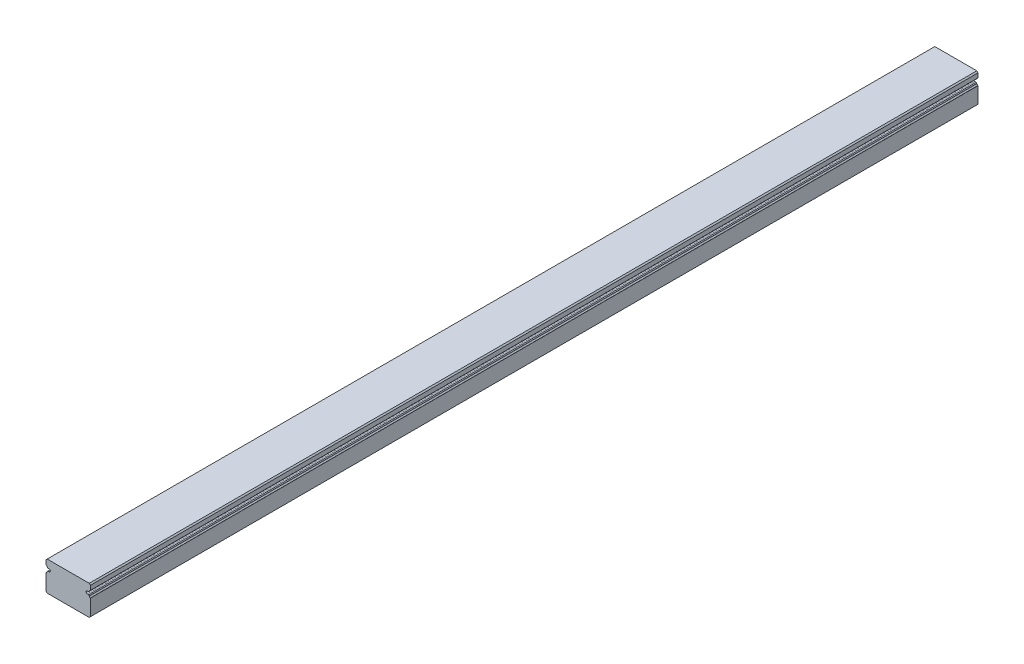
ISO-10303-21;
HEADER;
FILE_DESCRIPTION(('STEP AP214'),'2;1');
FILE_NAME('part.step','',(''),(''),'','','');
FILE_SCHEMA(('AUTOMOTIVE_DESIGN { 1 0 10303 214 1 1 1 1 }'));
ENDSEC;
DATA;
#1=APPLICATION_CONTEXT('core data for automotive mechanical design processes');
#2=APPLICATION_PROTOCOL_DEFINITION('international standard','automotive_design',2000,#1);
#3=PRODUCT_CONTEXT('',#1,'mechanical');
#4=PRODUCT('Part','Part','',(#3));
#5=PRODUCT_RELATED_PRODUCT_CATEGORY('part','',(#4));
#6=PRODUCT_DEFINITION_FORMATION('','',#4);
#7=PRODUCT_DEFINITION_CONTEXT('part definition',#1,'design');
#8=PRODUCT_DEFINITION('design','',#6,#7);
#9=PRODUCT_DEFINITION_SHAPE('','',#8);
#10=(LENGTH_UNIT() NAMED_UNIT(*) SI_UNIT(.MILLI.,.METRE.));
#11=(NAMED_UNIT(*) PLANE_ANGLE_UNIT() SI_UNIT($,.RADIAN.));
#12=(NAMED_UNIT(*) SI_UNIT($,.STERADIAN.) SOLID_ANGLE_UNIT());
#13=UNCERTAINTY_MEASURE_WITH_UNIT(LENGTH_MEASURE(1.E-05),#10,'distance_accuracy_value','');
#14=(GEOMETRIC_REPRESENTATION_CONTEXT(3) GLOBAL_UNCERTAINTY_ASSIGNED_CONTEXT((#13)) GLOBAL_UNIT_ASSIGNED_CONTEXT((#10,
#11,#12)) REPRESENTATION_CONTEXT('',''));
#15=CARTESIAN_POINT('',(0.,0.,0.));
#16=DIRECTION('',(0.,0.,1.));
#17=DIRECTION('',(1.,0.,0.));
#18=AXIS2_PLACEMENT_3D('',#15,#16,#17);
#19=CARTESIAN_POINT('',(7.51952374116363,1.28819952474976,150.));
#20=DIRECTION('',(0.,0.,-1.));
#21=DIRECTION('',(-1.,0.,0.));
#22=AXIS2_PLACEMENT_3D('',#19,#20,#21);
#23=CYLINDRICAL_SURFACE('',#22,0.400000000000003);
#24=CARTESIAN_POINT('',(7.51952374116363,1.28819952474976,-150.));
#25=DIRECTION('',(0.,0.,-1.));
#26=DIRECTION('',(1.,0.,0.));
#27=AXIS2_PLACEMENT_3D('',#24,#25,#26);
#28=CIRCLE('',#27,0.400000000000003);
#29=CARTESIAN_POINT('',(7.4639299734,0.8920816976,-150.));
#30=VERTEX_POINT('',#29);
#31=CARTESIAN_POINT('',(7.1195635475,1.2938425279,-150.));
#32=VERTEX_POINT('',#31);
#33=EDGE_CURVE('E250',#30,#32,#28,.T.);
#34=ORIENTED_EDGE('',*,*,#33,.T.);
#35=DIRECTION('',(0.,0.,-1.));
#36=VECTOR('',#35,1.);
#37=CARTESIAN_POINT('',(7.1195635475,1.2938425279,150.));
#38=LINE('',#37,#36);
#39=CARTESIAN_POINT('',(7.1195635475,1.2938425279,150.));
#40=VERTEX_POINT('',#39);
#41=EDGE_CURVE('E11',#40,#32,#38,.T.);
#42=ORIENTED_EDGE('',*,*,#41,.F.);
#43=CARTESIAN_POINT('',(7.51952374116363,1.28819952474976,150.));
#44=DIRECTION('',(0.,0.,-1.));
#45=DIRECTION('',(1.,0.,0.));
#46=AXIS2_PLACEMENT_3D('',#43,#44,#45);
#47=CIRCLE('',#46,0.400000000000003);
#48=CARTESIAN_POINT('',(7.4639299734,0.8920816976,150.));
#49=VERTEX_POINT('',#48);
#50=EDGE_CURVE('E304',#49,#40,#47,.T.);
#51=ORIENTED_EDGE('',*,*,#50,.F.);
#52=DIRECTION('',(0.,0.,-1.));
#53=VECTOR('',#52,1.);
#54=CARTESIAN_POINT('',(7.4639299734,0.8920816976,150.));
#55=LINE('',#54,#53);
#56=EDGE_CURVE('E246',#49,#30,#55,.T.);
#57=ORIENTED_EDGE('',*,*,#56,.T.);
#58=EDGE_LOOP('',(#34,#42,#51,#57));
#59=FACE_BOUND('',#58,.T.);
#60=ADVANCED_FACE('F34',(#59),#23,.F.);
#61=CARTESIAN_POINT('',(7.1195635475,1.2938425279,150.));
#62=DIRECTION('',(-0.759256602386219,-0.650791373431559,0.));
#63=DIRECTION('',(0.650791373431559,-0.759256602386219,0.));
#64=AXIS2_PLACEMENT_3D('',#61,#62,#63);
#65=PLANE('',#64);
#66=DIRECTION('',(-0.650791373431559,0.759256602386219,0.));
#67=VECTOR('',#66,1.);
#68=CARTESIAN_POINT('',(7.1195635475,1.2938425279,-150.));
#69=LINE('',#68,#67);
#70=CARTESIAN_POINT('',(6.9,1.55,-150.));
#71=VERTEX_POINT('',#70);
#72=EDGE_CURVE('E253',#32,#71,#69,.T.);
#73=ORIENTED_EDGE('',*,*,#72,.T.);
#74=DIRECTION('',(0.,0.,-1.));
#75=VECTOR('',#74,1.);
#76=CARTESIAN_POINT('',(6.9,1.55,150.));
#77=LINE('',#76,#75);
#78=CARTESIAN_POINT('',(6.9,1.55,150.));
#79=VERTEX_POINT('',#78);
#80=EDGE_CURVE('E42',#79,#71,#77,.T.);
#81=ORIENTED_EDGE('',*,*,#80,.F.);
#82=DIRECTION('',(-0.650791373431559,0.759256602386219,0.));
#83=VECTOR('',#82,1.);
#84=CARTESIAN_POINT('',(7.1195635475,1.2938425279,150.));
#85=LINE('',#84,#83);
#86=EDGE_CURVE('E153',#40,#79,#85,.T.);
#87=ORIENTED_EDGE('',*,*,#86,.F.);
#88=ORIENTED_EDGE('',*,*,#41,.T.);
#89=EDGE_LOOP('',(#73,#81,#87,#88));
#90=FACE_BOUND('',#89,.T.);
#91=ADVANCED_FACE('F462',(#90),#65,.F.);
#92=CARTESIAN_POINT('',(6.9,1.55,150.));
#93=DIRECTION('',(0.,-1.,0.));
#94=DIRECTION('',(0.,0.,-1.));
#95=AXIS2_PLACEMENT_3D('',#92,#93,#94);
#96=PLANE('',#95);
#97=DIRECTION('',(-1.,0.,0.));
#98=VECTOR('',#97,1.);
#99=CARTESIAN_POINT('',(6.9,1.55,-150.));
#100=LINE('',#99,#98);
#101=CARTESIAN_POINT('',(6.5,1.55,-150.));
#102=VERTEX_POINT('',#101);
#103=EDGE_CURVE('E255',#71,#102,#100,.T.);
#104=ORIENTED_EDGE('',*,*,#103,.T.);
#105=DIRECTION('',(0.,0.,-1.));
#106=VECTOR('',#105,1.);
#107=CARTESIAN_POINT('',(6.5,1.55,150.));
#108=LINE('',#107,#106);
#109=CARTESIAN_POINT('',(6.5,1.55,150.));
#110=VERTEX_POINT('',#109);
#111=EDGE_CURVE('E371',#110,#102,#108,.T.);
#112=ORIENTED_EDGE('',*,*,#111,.F.);
#113=DIRECTION('',(-1.,0.,0.));
#114=VECTOR('',#113,1.);
#115=CARTESIAN_POINT('',(6.9,1.55,150.));
#116=LINE('',#115,#114);
#117=EDGE_CURVE('E379',#79,#110,#116,.T.);
#118=ORIENTED_EDGE('',*,*,#117,.F.);
#119=ORIENTED_EDGE('',*,*,#80,.T.);
#120=EDGE_LOOP('',(#104,#112,#118,#119));
#121=FACE_BOUND('',#120,.T.);
#122=ADVANCED_FACE('F377',(#121),#96,.F.);
#123=CARTESIAN_POINT('',(6.5,2.,150.));
#124=DIRECTION('',(0.,0.,-1.));
#125=DIRECTION('',(-1.,0.,0.));
#126=AXIS2_PLACEMENT_3D('',#123,#124,#125);
#127=CYLINDRICAL_SURFACE('',#126,0.45);
#128=CARTESIAN_POINT('',(6.5,2.,-150.));
#129=DIRECTION('',(0.,0.,-1.));
#130=DIRECTION('',(1.,0.,0.));
#131=AXIS2_PLACEMENT_3D('',#128,#129,#130);
#132=CIRCLE('',#131,0.45);
#133=CARTESIAN_POINT('',(6.5,2.45,-150.));
#134=VERTEX_POINT('',#133);
#135=EDGE_CURVE('E257',#102,#134,#132,.T.);
#136=ORIENTED_EDGE('',*,*,#135,.T.);
#137=DIRECTION('',(0.,0.,-1.));
#138=VECTOR('',#137,1.);
#139=CARTESIAN_POINT('',(6.5,2.45,150.));
#140=LINE('',#139,#138);
#141=CARTESIAN_POINT('',(6.5,2.45,150.));
#142=VERTEX_POINT('',#141);
#143=EDGE_CURVE('E368',#142,#134,#140,.T.);
#144=ORIENTED_EDGE('',*,*,#143,.F.);
#145=CARTESIAN_POINT('',(6.5,2.,150.));
#146=DIRECTION('',(0.,0.,-1.));
#147=DIRECTION('',(1.,0.,0.));
#148=AXIS2_PLACEMENT_3D('',#145,#146,#147);
#149=CIRCLE('',#148,0.45);
#150=EDGE_CURVE('E397',#110,#142,#149,.T.);
#151=ORIENTED_EDGE('',*,*,#150,.F.);
#152=ORIENTED_EDGE('',*,*,#111,.T.);
#153=EDGE_LOOP('',(#136,#144,#151,#152));
#154=FACE_BOUND('',#153,.T.);
#155=ADVANCED_FACE('F388',(#154),#127,.F.);
#156=CARTESIAN_POINT('',(6.5,2.45,150.));
#157=DIRECTION('',(0.,1.,0.));
#158=DIRECTION('',(0.,0.,1.));
#159=AXIS2_PLACEMENT_3D('',#156,#157,#158);
#160=PLANE('',#159);
#161=DIRECTION('',(1.,0.,0.));
#162=VECTOR('',#161,1.);
#163=CARTESIAN_POINT('',(6.5,2.45,-150.));
#164=LINE('',#163,#162);
#165=CARTESIAN_POINT('',(6.9,2.45,-150.));
#166=VERTEX_POINT('',#165);
#167=EDGE_CURVE('E259',#134,#166,#164,.T.);
#168=ORIENTED_EDGE('',*,*,#167,.T.);
#169=DIRECTION('',(0.,0.,-1.));
#170=VECTOR('',#169,1.);
#171=CARTESIAN_POINT('',(6.9,2.45,150.));
#172=LINE('',#171,#170);
#173=CARTESIAN_POINT('',(6.9,2.45,150.));
#174=VERTEX_POINT('',#173);
#175=EDGE_CURVE('E365',#174,#166,#172,.T.);
#176=ORIENTED_EDGE('',*,*,#175,.F.);
#177=DIRECTION('',(1.,0.,0.));
#178=VECTOR('',#177,1.);
#179=CARTESIAN_POINT('',(6.5,2.45,150.));
#180=LINE('',#179,#178);
#181=EDGE_CURVE('E394',#142,#174,#180,.T.);
#182=ORIENTED_EDGE('',*,*,#181,.F.);
#183=ORIENTED_EDGE('',*,*,#143,.T.);
#184=EDGE_LOOP('',(#168,#176,#182,#183));
#185=FACE_BOUND('',#184,.T.);
#186=ADVANCED_FACE('F392',(#185),#160,.F.);
#187=CARTESIAN_POINT('',(6.9,2.45,150.));
#188=DIRECTION('',(-0.759256602386219,0.65079137343156,0.));
#189=DIRECTION('',(-0.65079137343156,-0.759256602386219,0.));
#190=AXIS2_PLACEMENT_3D('',#187,#188,#189);
#191=PLANE('',#190);
#192=DIRECTION('',(0.65079137343156,0.759256602386219,0.));
#193=VECTOR('',#192,1.);
#194=CARTESIAN_POINT('',(6.9,2.45,-150.));
#195=LINE('',#194,#193);
#196=CARTESIAN_POINT('',(7.1195635475,2.7061574721,-150.));
#197=VERTEX_POINT('',#196);
#198=EDGE_CURVE('E261',#166,#197,#195,.T.);
#199=ORIENTED_EDGE('',*,*,#198,.T.);
#200=DIRECTION('',(0.,0.,-1.));
#201=VECTOR('',#200,1.);
#202=CARTESIAN_POINT('',(7.1195635475,2.7061574721,150.));
#203=LINE('',#202,#201);
#204=CARTESIAN_POINT('',(7.1195635475,2.7061574721,150.));
#205=VERTEX_POINT('',#204);
#206=EDGE_CURVE('E362',#205,#197,#203,.T.);
#207=ORIENTED_EDGE('',*,*,#206,.F.);
#208=DIRECTION('',(0.65079137343156,0.759256602386219,0.));
#209=VECTOR('',#208,1.);
#210=CARTESIAN_POINT('',(6.9,2.45,150.));
#211=LINE('',#210,#209);
#212=EDGE_CURVE('E396',#174,#205,#211,.T.);
#213=ORIENTED_EDGE('',*,*,#212,.F.);
#214=ORIENTED_EDGE('',*,*,#175,.T.);
#215=EDGE_LOOP('',(#199,#207,#213,#214));
#216=FACE_BOUND('',#215,.T.);
#217=ADVANCED_FACE('F475',(#216),#191,.F.);
#218=CARTESIAN_POINT('',(7.51952374116363,2.71180047525024,150.));
#219=DIRECTION('',(0.,0.,-1.));
#220=DIRECTION('',(-1.,0.,0.));
#221=AXIS2_PLACEMENT_3D('',#218,#219,#220);
#222=CYLINDRICAL_SURFACE('',#221,0.400000000000004);
#223=CARTESIAN_POINT('',(7.51952374116363,2.71180047525024,-150.));
#224=DIRECTION('',(0.,0.,-1.));
#225=DIRECTION('',(1.,0.,0.));
#226=AXIS2_PLACEMENT_3D('',#223,#224,#225);
#227=CIRCLE('',#226,0.400000000000004);
#228=CARTESIAN_POINT('',(7.4639299734,3.1079183024,-150.));
#229=VERTEX_POINT('',#228);
#230=EDGE_CURVE('E263',#197,#229,#227,.T.);
#231=ORIENTED_EDGE('',*,*,#230,.T.);
#232=DIRECTION('',(0.,0.,-1.));
#233=VECTOR('',#232,1.);
#234=CARTESIAN_POINT('',(7.4639299734,3.1079183024,150.));
#235=LINE('',#234,#233);
#236=CARTESIAN_POINT('',(7.4639299734,3.1079183024,150.));
#237=VERTEX_POINT('',#236);
#238=EDGE_CURVE('E359',#237,#229,#235,.T.);
#239=ORIENTED_EDGE('',*,*,#238,.F.);
#240=CARTESIAN_POINT('',(7.51952374116363,2.71180047525024,150.));
#241=DIRECTION('',(0.,0.,-1.));
#242=DIRECTION('',(1.,0.,0.));
#243=AXIS2_PLACEMENT_3D('',#240,#241,#242);
#244=CIRCLE('',#243,0.400000000000004);
#245=EDGE_CURVE('E399',#205,#237,#244,.T.);
#246=ORIENTED_EDGE('',*,*,#245,.F.);
#247=ORIENTED_EDGE('',*,*,#206,.T.);
#248=EDGE_LOOP('',(#231,#239,#246,#247));
#249=FACE_BOUND('',#248,.T.);
#250=ADVANCED_FACE('F478',(#249),#222,.F.);
#251=CARTESIAN_POINT('',(7.4639299734,3.1079183024,150.));
#252=DIRECTION('',(-0.759256601601147,0.650791374347476,0.));
#253=DIRECTION('',(-0.650791374347476,-0.759256601601147,0.));
#254=AXIS2_PLACEMENT_3D('',#251,#252,#253);
#255=PLANE('',#254);
#256=DIRECTION('',(0.650791374347476,0.759256601601147,0.));
#257=VECTOR('',#256,1.);
#258=CARTESIAN_POINT('',(7.4639299734,3.1079183024,-150.));
#259=LINE('',#258,#257);
#260=CARTESIAN_POINT('',(7.5,3.15,-150.));
#261=VERTEX_POINT('',#260);
#262=EDGE_CURVE('E265',#229,#261,#259,.T.);
#263=ORIENTED_EDGE('',*,*,#262,.T.);
#264=DIRECTION('',(0.,0.,-1.));
#265=VECTOR('',#264,1.);
#266=CARTESIAN_POINT('',(7.5,3.15,150.));
#267=LINE('',#266,#265);
#268=CARTESIAN_POINT('',(7.5,3.15,150.));
#269=VERTEX_POINT('',#268);
#270=EDGE_CURVE('E356',#269,#261,#267,.T.);
#271=ORIENTED_EDGE('',*,*,#270,.F.);
#272=DIRECTION('',(0.650791374347476,0.759256601601147,0.));
#273=VECTOR('',#272,1.);
#274=CARTESIAN_POINT('',(7.4639299734,3.1079183024,150.));
#275=LINE('',#274,#273);
#276=EDGE_CURVE('E405',#237,#269,#275,.T.);
#277=ORIENTED_EDGE('',*,*,#276,.F.);
#278=ORIENTED_EDGE('',*,*,#238,.T.);
#279=EDGE_LOOP('',(#263,#271,#277,#278));
#280=FACE_BOUND('',#279,.T.);
#281=ADVANCED_FACE('F482',(#280),#255,.F.);
#282=CARTESIAN_POINT('',(7.5,3.15,150.));
#283=DIRECTION('',(-1.,0.,0.));
#284=DIRECTION('',(0.,0.,1.));
#285=AXIS2_PLACEMENT_3D('',#282,#283,#284);
#286=PLANE('',#285);
#287=DIRECTION('',(0.,1.,0.));
#288=VECTOR('',#287,1.);
#289=CARTESIAN_POINT('',(7.5,3.15,-150.));
#290=LINE('',#289,#288);
#291=CARTESIAN_POINT('',(7.5,4.6,-150.));
#292=VERTEX_POINT('',#291);
#293=EDGE_CURVE('E267',#261,#292,#290,.T.);
#294=ORIENTED_EDGE('',*,*,#293,.T.);
#295=DIRECTION('',(0.,0.,-1.));
#296=VECTOR('',#295,1.);
#297=CARTESIAN_POINT('',(7.5,4.6,150.));
#298=LINE('',#297,#296);
#299=CARTESIAN_POINT('',(7.5,4.6,150.));
#300=VERTEX_POINT('',#299);
#301=EDGE_CURVE('E353',#300,#292,#298,.T.);
#302=ORIENTED_EDGE('',*,*,#301,.F.);
#303=DIRECTION('',(0.,1.,0.));
#304=VECTOR('',#303,1.);
#305=CARTESIAN_POINT('',(7.5,3.15,150.));
#306=LINE('',#305,#304);
#307=EDGE_CURVE('E407',#269,#300,#306,.T.);
#308=ORIENTED_EDGE('',*,*,#307,.F.);
#309=ORIENTED_EDGE('',*,*,#270,.T.);
#310=EDGE_LOOP('',(#294,#302,#308,#309));
#311=FACE_BOUND('',#310,.T.);
#312=ADVANCED_FACE('F486',(#311),#286,.F.);
#313=CARTESIAN_POINT('',(7.5,4.6,150.));
#314=DIRECTION('',(-0.707106781186548,-0.707106781186548,0.));
#315=DIRECTION('',(0.707106781186548,-0.707106781186548,0.));
#316=AXIS2_PLACEMENT_3D('',#313,#314,#315);
#317=PLANE('',#316);
#318=DIRECTION('',(-0.707106781186548,0.707106781186548,0.));
#319=VECTOR('',#318,1.);
#320=CARTESIAN_POINT('',(7.5,4.6,-150.));
#321=LINE('',#320,#319);
#322=CARTESIAN_POINT('',(7.1,5.,-150.));
#323=VERTEX_POINT('',#322);
#324=EDGE_CURVE('E269',#292,#323,#321,.T.);
#325=ORIENTED_EDGE('',*,*,#324,.T.);
#326=DIRECTION('',(0.,0.,-1.));
#327=VECTOR('',#326,1.);
#328=CARTESIAN_POINT('',(7.1,5.,150.));
#329=LINE('',#328,#327);
#330=CARTESIAN_POINT('',(7.1,5.,150.));
#331=VERTEX_POINT('',#330);
#332=EDGE_CURVE('E350',#331,#323,#329,.T.);
#333=ORIENTED_EDGE('',*,*,#332,.F.);
#334=DIRECTION('',(-0.707106781186548,0.707106781186548,0.));
#335=VECTOR('',#334,1.);
#336=CARTESIAN_POINT('',(7.5,4.6,150.));
#337=LINE('',#336,#335);
#338=EDGE_CURVE('E409',#300,#331,#337,.T.);
#339=ORIENTED_EDGE('',*,*,#338,.F.);
#340=ORIENTED_EDGE('',*,*,#301,.T.);
#341=EDGE_LOOP('',(#325,#333,#339,#340));
#342=FACE_BOUND('',#341,.T.);
#343=ADVANCED_FACE('F490',(#342),#317,.F.);
#344=CARTESIAN_POINT('',(7.1,5.,150.));
#345=DIRECTION('',(0.,-1.,0.));
#346=DIRECTION('',(0.,0.,-1.));
#347=AXIS2_PLACEMENT_3D('',#344,#345,#346);
#348=PLANE('',#347);
#349=DIRECTION('',(-1.,0.,0.));
#350=VECTOR('',#349,1.);
#351=CARTESIAN_POINT('',(7.1,5.,-150.));
#352=LINE('',#351,#350);
#353=CARTESIAN_POINT('',(-7.1,5.,-150.));
#354=VERTEX_POINT('',#353);
#355=EDGE_CURVE('E271',#323,#354,#352,.T.);
#356=ORIENTED_EDGE('',*,*,#355,.T.);
#357=DIRECTION('',(0.,0.,-1.));
#358=VECTOR('',#357,1.);
#359=CARTESIAN_POINT('',(-7.1,5.,150.));
#360=LINE('',#359,#358);
#361=CARTESIAN_POINT('',(-7.1,5.,150.));
#362=VERTEX_POINT('',#361);
#363=EDGE_CURVE('E347',#362,#354,#360,.T.);
#364=ORIENTED_EDGE('',*,*,#363,.F.);
#365=DIRECTION('',(-1.,0.,0.));
#366=VECTOR('',#365,1.);
#367=CARTESIAN_POINT('',(7.1,5.,150.));
#368=LINE('',#367,#366);
#369=EDGE_CURVE('E411',#331,#362,#368,.T.);
#370=ORIENTED_EDGE('',*,*,#369,.F.);
#371=ORIENTED_EDGE('',*,*,#332,.T.);
#372=EDGE_LOOP('',(#356,#364,#370,#371));
#373=FACE_BOUND('',#372,.T.);
#374=ADVANCED_FACE('F494',(#373),#348,.F.);
#375=CARTESIAN_POINT('',(-7.1,5.,150.));
#376=DIRECTION('',(0.707106781186548,-0.707106781186548,0.));
#377=DIRECTION('',(0.707106781186548,0.707106781186548,0.));
#378=AXIS2_PLACEMENT_3D('',#375,#376,#377);
#379=PLANE('',#378);
#380=DIRECTION('',(-0.707106781186548,-0.707106781186548,0.));
#381=VECTOR('',#380,1.);
#382=CARTESIAN_POINT('',(-7.1,5.,-150.));
#383=LINE('',#382,#381);
#384=CARTESIAN_POINT('',(-7.5,4.6,-150.));
#385=VERTEX_POINT('',#384);
#386=EDGE_CURVE('E273',#354,#385,#383,.T.);
#387=ORIENTED_EDGE('',*,*,#386,.T.);
#388=DIRECTION('',(0.,0.,-1.));
#389=VECTOR('',#388,1.);
#390=CARTESIAN_POINT('',(-7.5,4.6,150.));
#391=LINE('',#390,#389);
#392=CARTESIAN_POINT('',(-7.5,4.6,150.));
#393=VERTEX_POINT('',#392);
#394=EDGE_CURVE('E344',#393,#385,#391,.T.);
#395=ORIENTED_EDGE('',*,*,#394,.F.);
#396=DIRECTION('',(-0.707106781186548,-0.707106781186548,0.));
#397=VECTOR('',#396,1.);
#398=CARTESIAN_POINT('',(-7.1,5.,150.));
#399=LINE('',#398,#397);
#400=EDGE_CURVE('E413',#362,#393,#399,.T.);
#401=ORIENTED_EDGE('',*,*,#400,.F.);
#402=ORIENTED_EDGE('',*,*,#363,.T.);
#403=EDGE_LOOP('',(#387,#395,#401,#402));
#404=FACE_BOUND('',#403,.T.);
#405=ADVANCED_FACE('F498',(#404),#379,.F.);
#406=CARTESIAN_POINT('',(-7.5,4.6,150.));
#407=DIRECTION('',(1.,0.,0.));
#408=DIRECTION('',(0.,0.,-1.));
#409=AXIS2_PLACEMENT_3D('',#406,#407,#408);
#410=PLANE('',#409);
#411=DIRECTION('',(0.,-1.,0.));
#412=VECTOR('',#411,1.);
#413=CARTESIAN_POINT('',(-7.5,4.6,-150.));
#414=LINE('',#413,#412);
#415=CARTESIAN_POINT('',(-7.5,3.15,-150.));
#416=VERTEX_POINT('',#415);
#417=EDGE_CURVE('E275',#385,#416,#414,.T.);
#418=ORIENTED_EDGE('',*,*,#417,.T.);
#419=DIRECTION('',(0.,0.,-1.));
#420=VECTOR('',#419,1.);
#421=CARTESIAN_POINT('',(-7.5,3.15,150.));
#422=LINE('',#421,#420);
#423=CARTESIAN_POINT('',(-7.5,3.15,150.));
#424=VERTEX_POINT('',#423);
#425=EDGE_CURVE('E341',#424,#416,#422,.T.);
#426=ORIENTED_EDGE('',*,*,#425,.F.);
#427=DIRECTION('',(0.,-1.,0.));
#428=VECTOR('',#427,1.);
#429=CARTESIAN_POINT('',(-7.5,4.6,150.));
#430=LINE('',#429,#428);
#431=EDGE_CURVE('E415',#393,#424,#430,.T.);
#432=ORIENTED_EDGE('',*,*,#431,.F.);
#433=ORIENTED_EDGE('',*,*,#394,.T.);
#434=EDGE_LOOP('',(#418,#426,#432,#433));
#435=FACE_BOUND('',#434,.T.);
#436=ADVANCED_FACE('F502',(#435),#410,.F.);
#437=CARTESIAN_POINT('',(-7.5,3.15,150.));
#438=DIRECTION('',(0.759256601601147,0.650791374347476,0.));
#439=DIRECTION('',(-0.650791374347476,0.759256601601147,0.));
#440=AXIS2_PLACEMENT_3D('',#437,#438,#439);
#441=PLANE('',#440);
#442=DIRECTION('',(0.650791374347476,-0.759256601601147,0.));
#443=VECTOR('',#442,1.);
#444=CARTESIAN_POINT('',(-7.5,3.15,-150.));
#445=LINE('',#444,#443);
#446=CARTESIAN_POINT('',(-7.4639299734,3.1079183024,-150.));
#447=VERTEX_POINT('',#446);
#448=EDGE_CURVE('E277',#416,#447,#445,.T.);
#449=ORIENTED_EDGE('',*,*,#448,.T.);
#450=DIRECTION('',(0.,0.,-1.));
#451=VECTOR('',#450,1.);
#452=CARTESIAN_POINT('',(-7.4639299734,3.1079183024,150.));
#453=LINE('',#452,#451);
#454=CARTESIAN_POINT('',(-7.4639299734,3.1079183024,150.));
#455=VERTEX_POINT('',#454);
#456=EDGE_CURVE('E338',#455,#447,#453,.T.);
#457=ORIENTED_EDGE('',*,*,#456,.F.);
#458=DIRECTION('',(0.650791374347476,-0.759256601601147,0.));
#459=VECTOR('',#458,1.);
#460=CARTESIAN_POINT('',(-7.5,3.15,150.));
#461=LINE('',#460,#459);
#462=EDGE_CURVE('E417',#424,#455,#461,.T.);
#463=ORIENTED_EDGE('',*,*,#462,.F.);
#464=ORIENTED_EDGE('',*,*,#425,.T.);
#465=EDGE_LOOP('',(#449,#457,#463,#464));
#466=FACE_BOUND('',#465,.T.);
#467=ADVANCED_FACE('F506',(#466),#441,.F.);
#468=CARTESIAN_POINT('',(-7.51952374116363,2.71180047525024,150.));
#469=DIRECTION('',(0.,0.,-1.));
#470=DIRECTION('',(-1.,0.,0.));
#471=AXIS2_PLACEMENT_3D('',#468,#469,#470);
#472=CYLINDRICAL_SURFACE('',#471,0.400000000000003);
#473=CARTESIAN_POINT('',(-7.51952374116363,2.71180047525024,-150.));
#474=DIRECTION('',(0.,0.,-1.));
#475=DIRECTION('',(1.,0.,0.));
#476=AXIS2_PLACEMENT_3D('',#473,#474,#475);
#477=CIRCLE('',#476,0.400000000000003);
#478=CARTESIAN_POINT('',(-7.1195635475,2.7061574721,-150.));
#479=VERTEX_POINT('',#478);
#480=EDGE_CURVE('E279',#447,#479,#477,.T.);
#481=ORIENTED_EDGE('',*,*,#480,.T.);
#482=DIRECTION('',(0.,0.,-1.));
#483=VECTOR('',#482,1.);
#484=CARTESIAN_POINT('',(-7.1195635475,2.7061574721,150.));
#485=LINE('',#484,#483);
#486=CARTESIAN_POINT('',(-7.1195635475,2.7061574721,150.));
#487=VERTEX_POINT('',#486);
#488=EDGE_CURVE('E335',#487,#479,#485,.T.);
#489=ORIENTED_EDGE('',*,*,#488,.F.);
#490=CARTESIAN_POINT('',(-7.51952374116363,2.71180047525024,150.));
#491=DIRECTION('',(0.,0.,-1.));
#492=DIRECTION('',(1.,0.,0.));
#493=AXIS2_PLACEMENT_3D('',#490,#491,#492);
#494=CIRCLE('',#493,0.400000000000003);
#495=EDGE_CURVE('E419',#455,#487,#494,.T.);
#496=ORIENTED_EDGE('',*,*,#495,.F.);
#497=ORIENTED_EDGE('',*,*,#456,.T.);
#498=EDGE_LOOP('',(#481,#489,#496,#497));
#499=FACE_BOUND('',#498,.T.);
#500=ADVANCED_FACE('F510',(#499),#472,.F.);
#501=CARTESIAN_POINT('',(-7.1195635475,2.7061574721,150.));
#502=DIRECTION('',(0.759256602386219,0.65079137343156,0.));
#503=DIRECTION('',(-0.65079137343156,0.759256602386219,0.));
#504=AXIS2_PLACEMENT_3D('',#501,#502,#503);
#505=PLANE('',#504);
#506=DIRECTION('',(0.65079137343156,-0.759256602386219,0.));
#507=VECTOR('',#506,1.);
#508=CARTESIAN_POINT('',(-7.1195635475,2.7061574721,-150.));
#509=LINE('',#508,#507);
#510=CARTESIAN_POINT('',(-6.9,2.45,-150.));
#511=VERTEX_POINT('',#510);
#512=EDGE_CURVE('E281',#479,#511,#509,.T.);
#513=ORIENTED_EDGE('',*,*,#512,.T.);
#514=DIRECTION('',(0.,0.,-1.));
#515=VECTOR('',#514,1.);
#516=CARTESIAN_POINT('',(-6.9,2.45,150.));
#517=LINE('',#516,#515);
#518=CARTESIAN_POINT('',(-6.9,2.45,150.));
#519=VERTEX_POINT('',#518);
#520=EDGE_CURVE('E332',#519,#511,#517,.T.);
#521=ORIENTED_EDGE('',*,*,#520,.F.);
#522=DIRECTION('',(0.65079137343156,-0.759256602386219,0.));
#523=VECTOR('',#522,1.);
#524=CARTESIAN_POINT('',(-7.1195635475,2.7061574721,150.));
#525=LINE('',#524,#523);
#526=EDGE_CURVE('E421',#487,#519,#525,.T.);
#527=ORIENTED_EDGE('',*,*,#526,.F.);
#528=ORIENTED_EDGE('',*,*,#488,.T.);
#529=EDGE_LOOP('',(#513,#521,#527,#528));
#530=FACE_BOUND('',#529,.T.);
#531=ADVANCED_FACE('F514',(#530),#505,.F.);
#532=CARTESIAN_POINT('',(-6.9,2.45,150.));
#533=DIRECTION('',(0.,1.,0.));
#534=DIRECTION('',(0.,0.,1.));
#535=AXIS2_PLACEMENT_3D('',#532,#533,#534);
#536=PLANE('',#535);
#537=DIRECTION('',(1.,0.,0.));
#538=VECTOR('',#537,1.);
#539=CARTESIAN_POINT('',(-6.9,2.45,-150.));
#540=LINE('',#539,#538);
#541=CARTESIAN_POINT('',(-6.5,2.45,-150.));
#542=VERTEX_POINT('',#541);
#543=EDGE_CURVE('E283',#511,#542,#540,.T.);
#544=ORIENTED_EDGE('',*,*,#543,.T.);
#545=DIRECTION('',(0.,0.,-1.));
#546=VECTOR('',#545,1.);
#547=CARTESIAN_POINT('',(-6.5,2.45,150.));
#548=LINE('',#547,#546);
#549=CARTESIAN_POINT('',(-6.5,2.45,150.));
#550=VERTEX_POINT('',#549);
#551=EDGE_CURVE('E329',#550,#542,#548,.T.);
#552=ORIENTED_EDGE('',*,*,#551,.F.);
#553=DIRECTION('',(1.,0.,0.));
#554=VECTOR('',#553,1.);
#555=CARTESIAN_POINT('',(-6.9,2.45,150.));
#556=LINE('',#555,#554);
#557=EDGE_CURVE('E423',#519,#550,#556,.T.);
#558=ORIENTED_EDGE('',*,*,#557,.F.);
#559=ORIENTED_EDGE('',*,*,#520,.T.);
#560=EDGE_LOOP('',(#544,#552,#558,#559));
#561=FACE_BOUND('',#560,.T.);
#562=ADVANCED_FACE('F518',(#561),#536,.F.);
#563=CARTESIAN_POINT('',(-6.5,2.,150.));
#564=DIRECTION('',(0.,0.,-1.));
#565=DIRECTION('',(-1.,0.,0.));
#566=AXIS2_PLACEMENT_3D('',#563,#564,#565);
#567=CYLINDRICAL_SURFACE('',#566,0.45);
#568=CARTESIAN_POINT('',(-6.5,2.,-150.));
#569=DIRECTION('',(0.,0.,-1.));
#570=DIRECTION('',(1.,0.,0.));
#571=AXIS2_PLACEMENT_3D('',#568,#569,#570);
#572=CIRCLE('',#571,0.45);
#573=CARTESIAN_POINT('',(-6.5,1.55,-150.));
#574=VERTEX_POINT('',#573);
#575=EDGE_CURVE('E285',#542,#574,#572,.T.);
#576=ORIENTED_EDGE('',*,*,#575,.T.);
#577=DIRECTION('',(0.,0.,-1.));
#578=VECTOR('',#577,1.);
#579=CARTESIAN_POINT('',(-6.5,1.55,150.));
#580=LINE('',#579,#578);
#581=CARTESIAN_POINT('',(-6.5,1.55,150.));
#582=VERTEX_POINT('',#581);
#583=EDGE_CURVE('E326',#582,#574,#580,.T.);
#584=ORIENTED_EDGE('',*,*,#583,.F.);
#585=CARTESIAN_POINT('',(-6.5,2.,150.));
#586=DIRECTION('',(0.,0.,-1.));
#587=DIRECTION('',(1.,0.,0.));
#588=AXIS2_PLACEMENT_3D('',#585,#586,#587);
#589=CIRCLE('',#588,0.45);
#590=EDGE_CURVE('E425',#550,#582,#589,.T.);
#591=ORIENTED_EDGE('',*,*,#590,.F.);
#592=ORIENTED_EDGE('',*,*,#551,.T.);
#593=EDGE_LOOP('',(#576,#584,#591,#592));
#594=FACE_BOUND('',#593,.T.);
#595=ADVANCED_FACE('F522',(#594),#567,.F.);
#596=CARTESIAN_POINT('',(-6.5,1.55,150.));
#597=DIRECTION('',(0.,-1.,0.));
#598=DIRECTION('',(0.,0.,-1.));
#599=AXIS2_PLACEMENT_3D('',#596,#597,#598);
#600=PLANE('',#599);
#601=DIRECTION('',(-1.,0.,0.));
#602=VECTOR('',#601,1.);
#603=CARTESIAN_POINT('',(-6.5,1.55,-150.));
#604=LINE('',#603,#602);
#605=CARTESIAN_POINT('',(-6.9,1.55,-150.));
#606=VERTEX_POINT('',#605);
#607=EDGE_CURVE('E287',#574,#606,#604,.T.);
#608=ORIENTED_EDGE('',*,*,#607,.T.);
#609=DIRECTION('',(0.,0.,-1.));
#610=VECTOR('',#609,1.);
#611=CARTESIAN_POINT('',(-6.9,1.55,150.));
#612=LINE('',#611,#610);
#613=CARTESIAN_POINT('',(-6.9,1.55,150.));
#614=VERTEX_POINT('',#613);
#615=EDGE_CURVE('E323',#614,#606,#612,.T.);
#616=ORIENTED_EDGE('',*,*,#615,.F.);
#617=DIRECTION('',(-1.,0.,0.));
#618=VECTOR('',#617,1.);
#619=CARTESIAN_POINT('',(-6.5,1.55,150.));
#620=LINE('',#619,#618);
#621=EDGE_CURVE('E427',#582,#614,#620,.T.);
#622=ORIENTED_EDGE('',*,*,#621,.F.);
#623=ORIENTED_EDGE('',*,*,#583,.T.);
#624=EDGE_LOOP('',(#608,#616,#622,#623));
#625=FACE_BOUND('',#624,.T.);
#626=ADVANCED_FACE('F526',(#625),#600,.F.);
#627=CARTESIAN_POINT('',(-6.9,1.55,150.));
#628=DIRECTION('',(0.759256602386219,-0.650791373431559,0.));
#629=DIRECTION('',(0.650791373431559,0.759256602386219,0.));
#630=AXIS2_PLACEMENT_3D('',#627,#628,#629);
#631=PLANE('',#630);
#632=DIRECTION('',(-0.650791373431559,-0.759256602386219,0.));
#633=VECTOR('',#632,1.);
#634=CARTESIAN_POINT('',(-6.9,1.55,-150.));
#635=LINE('',#634,#633);
#636=CARTESIAN_POINT('',(-7.1195635475,1.2938425279,-150.));
#637=VERTEX_POINT('',#636);
#638=EDGE_CURVE('E289',#606,#637,#635,.T.);
#639=ORIENTED_EDGE('',*,*,#638,.T.);
#640=DIRECTION('',(0.,0.,-1.));
#641=VECTOR('',#640,1.);
#642=CARTESIAN_POINT('',(-7.1195635475,1.2938425279,150.));
#643=LINE('',#642,#641);
#644=CARTESIAN_POINT('',(-7.1195635475,1.2938425279,150.));
#645=VERTEX_POINT('',#644);
#646=EDGE_CURVE('E320',#645,#637,#643,.T.);
#647=ORIENTED_EDGE('',*,*,#646,.F.);
#648=DIRECTION('',(-0.650791373431559,-0.759256602386219,0.));
#649=VECTOR('',#648,1.);
#650=CARTESIAN_POINT('',(-6.9,1.55,150.));
#651=LINE('',#650,#649);
#652=EDGE_CURVE('E429',#614,#645,#651,.T.);
#653=ORIENTED_EDGE('',*,*,#652,.F.);
#654=ORIENTED_EDGE('',*,*,#615,.T.);
#655=EDGE_LOOP('',(#639,#647,#653,#654));
#656=FACE_BOUND('',#655,.T.);
#657=ADVANCED_FACE('F530',(#656),#631,.F.);
#658=CARTESIAN_POINT('',(-7.51952374116363,1.28819952474976,150.));
#659=DIRECTION('',(0.,0.,-1.));
#660=DIRECTION('',(-1.,0.,0.));
#661=AXIS2_PLACEMENT_3D('',#658,#659,#660);
#662=CYLINDRICAL_SURFACE('',#661,0.400000000000003);
#663=CARTESIAN_POINT('',(-7.51952374116363,1.28819952474976,-150.));
#664=DIRECTION('',(0.,0.,-1.));
#665=DIRECTION('',(1.,0.,0.));
#666=AXIS2_PLACEMENT_3D('',#663,#664,#665);
#667=CIRCLE('',#666,0.400000000000003);
#668=CARTESIAN_POINT('',(-7.4639299734,0.8920816976,-150.));
#669=VERTEX_POINT('',#668);
#670=EDGE_CURVE('E291',#637,#669,#667,.T.);
#671=ORIENTED_EDGE('',*,*,#670,.T.);
#672=DIRECTION('',(0.,0.,-1.));
#673=VECTOR('',#672,1.);
#674=CARTESIAN_POINT('',(-7.4639299734,0.8920816976,150.));
#675=LINE('',#674,#673);
#676=CARTESIAN_POINT('',(-7.4639299734,0.8920816976,150.));
#677=VERTEX_POINT('',#676);
#678=EDGE_CURVE('E317',#677,#669,#675,.T.);
#679=ORIENTED_EDGE('',*,*,#678,.F.);
#680=CARTESIAN_POINT('',(-7.51952374116363,1.28819952474976,150.));
#681=DIRECTION('',(0.,0.,-1.));
#682=DIRECTION('',(1.,0.,0.));
#683=AXIS2_PLACEMENT_3D('',#680,#681,#682);
#684=CIRCLE('',#683,0.400000000000003);
#685=EDGE_CURVE('E431',#645,#677,#684,.T.);
#686=ORIENTED_EDGE('',*,*,#685,.F.);
#687=ORIENTED_EDGE('',*,*,#646,.T.);
#688=EDGE_LOOP('',(#671,#679,#686,#687));
#689=FACE_BOUND('',#688,.T.);
#690=ADVANCED_FACE('F534',(#689),#662,.F.);
#691=CARTESIAN_POINT('',(-7.4639299734,0.8920816976,150.));
#692=DIRECTION('',(0.759256601601146,-0.650791374347477,0.));
#693=DIRECTION('',(0.650791374347477,0.759256601601146,0.));
#694=AXIS2_PLACEMENT_3D('',#691,#692,#693);
#695=PLANE('',#694);
#696=DIRECTION('',(-0.650791374347477,-0.759256601601146,0.));
#697=VECTOR('',#696,1.);
#698=CARTESIAN_POINT('',(-7.4639299734,0.8920816976,-150.));
#699=LINE('',#698,#697);
#700=CARTESIAN_POINT('',(-7.5,0.85,-150.));
#701=VERTEX_POINT('',#700);
#702=EDGE_CURVE('E293',#669,#701,#699,.T.);
#703=ORIENTED_EDGE('',*,*,#702,.T.);
#704=DIRECTION('',(0.,0.,-1.));
#705=VECTOR('',#704,1.);
#706=CARTESIAN_POINT('',(-7.5,0.85,150.));
#707=LINE('',#706,#705);
#708=CARTESIAN_POINT('',(-7.5,0.85,150.));
#709=VERTEX_POINT('',#708);
#710=EDGE_CURVE('E314',#709,#701,#707,.T.);
#711=ORIENTED_EDGE('',*,*,#710,.F.);
#712=DIRECTION('',(-0.650791374347477,-0.759256601601146,0.));
#713=VECTOR('',#712,1.);
#714=CARTESIAN_POINT('',(-7.4639299734,0.8920816976,150.));
#715=LINE('',#714,#713);
#716=EDGE_CURVE('E433',#677,#709,#715,.T.);
#717=ORIENTED_EDGE('',*,*,#716,.F.);
#718=ORIENTED_EDGE('',*,*,#678,.T.);
#719=EDGE_LOOP('',(#703,#711,#717,#718));
#720=FACE_BOUND('',#719,.T.);
#721=ADVANCED_FACE('F538',(#720),#695,.F.);
#722=CARTESIAN_POINT('',(-7.5,0.85,150.));
#723=DIRECTION('',(1.,0.,0.));
#724=DIRECTION('',(0.,0.,-1.));
#725=AXIS2_PLACEMENT_3D('',#722,#723,#724);
#726=PLANE('',#725);
#727=DIRECTION('',(0.,-1.,0.));
#728=VECTOR('',#727,1.);
#729=CARTESIAN_POINT('',(-7.5,0.85,-150.));
#730=LINE('',#729,#728);
#731=CARTESIAN_POINT('',(-7.5,-4.6,-150.));
#732=VERTEX_POINT('',#731);
#733=EDGE_CURVE('E295',#701,#732,#730,.T.);
#734=ORIENTED_EDGE('',*,*,#733,.T.);
#735=DIRECTION('',(0.,0.,-1.));
#736=VECTOR('',#735,1.);
#737=CARTESIAN_POINT('',(-7.5,-4.6,150.));
#738=LINE('',#737,#736);
#739=CARTESIAN_POINT('',(-7.5,-4.6,150.));
#740=VERTEX_POINT('',#739);
#741=EDGE_CURVE('E311',#740,#732,#738,.T.);
#742=ORIENTED_EDGE('',*,*,#741,.F.);
#743=DIRECTION('',(0.,-1.,0.));
#744=VECTOR('',#743,1.);
#745=CARTESIAN_POINT('',(-7.5,0.85,150.));
#746=LINE('',#745,#744);
#747=EDGE_CURVE('E435',#709,#740,#746,.T.);
#748=ORIENTED_EDGE('',*,*,#747,.F.);
#749=ORIENTED_EDGE('',*,*,#710,.T.);
#750=EDGE_LOOP('',(#734,#742,#748,#749));
#751=FACE_BOUND('',#750,.T.);
#752=ADVANCED_FACE('F542',(#751),#726,.F.);
#753=CARTESIAN_POINT('',(-7.5,-4.6,150.));
#754=DIRECTION('',(0.707106781186548,0.707106781186548,0.));
#755=DIRECTION('',(-0.707106781186548,0.707106781186548,0.));
#756=AXIS2_PLACEMENT_3D('',#753,#754,#755);
#757=PLANE('',#756);
#758=DIRECTION('',(0.707106781186548,-0.707106781186548,0.));
#759=VECTOR('',#758,1.);
#760=CARTESIAN_POINT('',(-7.5,-4.6,-150.));
#761=LINE('',#760,#759);
#762=CARTESIAN_POINT('',(-7.1,-5.,-150.));
#763=VERTEX_POINT('',#762);
#764=EDGE_CURVE('E297',#732,#763,#761,.T.);
#765=ORIENTED_EDGE('',*,*,#764,.T.);
#766=DIRECTION('',(0.,0.,-1.));
#767=VECTOR('',#766,1.);
#768=CARTESIAN_POINT('',(-7.1,-5.,150.));
#769=LINE('',#768,#767);
#770=CARTESIAN_POINT('',(-7.1,-5.,150.));
#771=VERTEX_POINT('',#770);
#772=EDGE_CURVE('E308',#771,#763,#769,.T.);
#773=ORIENTED_EDGE('',*,*,#772,.F.);
#774=DIRECTION('',(0.707106781186548,-0.707106781186548,0.));
#775=VECTOR('',#774,1.);
#776=CARTESIAN_POINT('',(-7.5,-4.6,150.));
#777=LINE('',#776,#775);
#778=EDGE_CURVE('E437',#740,#771,#777,.T.);
#779=ORIENTED_EDGE('',*,*,#778,.F.);
#780=ORIENTED_EDGE('',*,*,#741,.T.);
#781=EDGE_LOOP('',(#765,#773,#779,#780));
#782=FACE_BOUND('',#781,.T.);
#783=ADVANCED_FACE('F443',(#782),#757,.F.);
#784=CARTESIAN_POINT('',(-7.1,-5.,150.));
#785=DIRECTION('',(0.,1.,0.));
#786=DIRECTION('',(0.,0.,1.));
#787=AXIS2_PLACEMENT_3D('',#784,#785,#786);
#788=PLANE('',#787);
#789=DIRECTION('',(1.,0.,0.));
#790=VECTOR('',#789,1.);
#791=CARTESIAN_POINT('',(-7.1,-5.,-150.));
#792=LINE('',#791,#790);
#793=CARTESIAN_POINT('',(7.1,-5.,-150.));
#794=VERTEX_POINT('',#793);
#795=EDGE_CURVE('E299',#763,#794,#792,.T.);
#796=ORIENTED_EDGE('',*,*,#795,.T.);
#797=DIRECTION('',(0.,0.,-1.));
#798=VECTOR('',#797,1.);
#799=CARTESIAN_POINT('',(7.1,-5.,150.));
#800=LINE('',#799,#798);
#801=CARTESIAN_POINT('',(7.1,-5.,150.));
#802=VERTEX_POINT('',#801);
#803=EDGE_CURVE('E241',#802,#794,#800,.T.);
#804=ORIENTED_EDGE('',*,*,#803,.F.);
#805=DIRECTION('',(1.,0.,0.));
#806=VECTOR('',#805,1.);
#807=CARTESIAN_POINT('',(-7.1,-5.,150.));
#808=LINE('',#807,#806);
#809=EDGE_CURVE('E232',#771,#802,#808,.T.);
#810=ORIENTED_EDGE('',*,*,#809,.F.);
#811=ORIENTED_EDGE('',*,*,#772,.T.);
#812=EDGE_LOOP('',(#796,#804,#810,#811));
#813=FACE_BOUND('',#812,.T.);
#814=ADVANCED_FACE('F447',(#813),#788,.F.);
#815=CARTESIAN_POINT('',(7.1,-5.,150.));
#816=DIRECTION('',(-0.707106781186548,0.707106781186548,0.));
#817=DIRECTION('',(-0.707106781186548,-0.707106781186548,0.));
#818=AXIS2_PLACEMENT_3D('',#815,#816,#817);
#819=PLANE('',#818);
#820=DIRECTION('',(0.707106781186548,0.707106781186548,0.));
#821=VECTOR('',#820,1.);
#822=CARTESIAN_POINT('',(7.1,-5.,-150.));
#823=LINE('',#822,#821);
#824=CARTESIAN_POINT('',(7.5,-4.6,-150.));
#825=VERTEX_POINT('',#824);
#826=EDGE_CURVE('E240',#794,#825,#823,.T.);
#827=ORIENTED_EDGE('',*,*,#826,.T.);
#828=DIRECTION('',(0.,0.,-1.));
#829=VECTOR('',#828,1.);
#830=CARTESIAN_POINT('',(7.5,-4.6,150.));
#831=LINE('',#830,#829);
#832=CARTESIAN_POINT('',(7.5,-4.6,150.));
#833=VERTEX_POINT('',#832);
#834=EDGE_CURVE('E237',#833,#825,#831,.T.);
#835=ORIENTED_EDGE('',*,*,#834,.F.);
#836=DIRECTION('',(0.707106781186548,0.707106781186548,0.));
#837=VECTOR('',#836,1.);
#838=CARTESIAN_POINT('',(7.1,-5.,150.));
#839=LINE('',#838,#837);
#840=EDGE_CURVE('E226',#802,#833,#839,.T.);
#841=ORIENTED_EDGE('',*,*,#840,.F.);
#842=ORIENTED_EDGE('',*,*,#803,.T.);
#843=EDGE_LOOP('',(#827,#835,#841,#842));
#844=FACE_BOUND('',#843,.T.);
#845=ADVANCED_FACE('F238',(#844),#819,.F.);
#846=CARTESIAN_POINT('',(7.5,-4.6,150.));
#847=DIRECTION('',(-1.,0.,0.));
#848=DIRECTION('',(0.,0.,1.));
#849=AXIS2_PLACEMENT_3D('',#846,#847,#848);
#850=PLANE('',#849);
#851=DIRECTION('',(0.,1.,0.));
#852=VECTOR('',#851,1.);
#853=CARTESIAN_POINT('',(7.5,-4.6,-150.));
#854=LINE('',#853,#852);
#855=CARTESIAN_POINT('',(7.5,0.85,-150.));
#856=VERTEX_POINT('',#855);
#857=EDGE_CURVE('E139',#825,#856,#854,.T.);
#858=ORIENTED_EDGE('',*,*,#857,.T.);
#859=DIRECTION('',(0.,0.,-1.));
#860=VECTOR('',#859,1.);
#861=CARTESIAN_POINT('',(7.5,0.85,150.));
#862=LINE('',#861,#860);
#863=CARTESIAN_POINT('',(7.5,0.85,150.));
#864=VERTEX_POINT('',#863);
#865=EDGE_CURVE('E242',#864,#856,#862,.T.);
#866=ORIENTED_EDGE('',*,*,#865,.F.);
#867=DIRECTION('',(0.,1.,0.));
#868=VECTOR('',#867,1.);
#869=CARTESIAN_POINT('',(7.5,-4.6,150.));
#870=LINE('',#869,#868);
#871=EDGE_CURVE('E230',#833,#864,#870,.T.);
#872=ORIENTED_EDGE('',*,*,#871,.F.);
#873=ORIENTED_EDGE('',*,*,#834,.T.);
#874=EDGE_LOOP('',(#858,#866,#872,#873));
#875=FACE_BOUND('',#874,.T.);
#876=ADVANCED_FACE('F244',(#875),#850,.F.);
#877=CARTESIAN_POINT('',(7.5,0.85,150.));
#878=DIRECTION('',(-0.759256601601146,-0.650791374347477,0.));
#879=DIRECTION('',(0.650791374347477,-0.759256601601146,0.));
#880=AXIS2_PLACEMENT_3D('',#877,#878,#879);
#881=PLANE('',#880);
#882=DIRECTION('',(-0.650791374347477,0.759256601601146,0.));
#883=VECTOR('',#882,1.);
#884=CARTESIAN_POINT('',(7.5,0.85,-150.));
#885=LINE('',#884,#883);
#886=EDGE_CURVE('E145',#856,#30,#885,.T.);
#887=ORIENTED_EDGE('',*,*,#886,.T.);
#888=ORIENTED_EDGE('',*,*,#56,.F.);
#889=DIRECTION('',(-0.650791374347477,0.759256601601146,0.));
#890=VECTOR('',#889,1.);
#891=CARTESIAN_POINT('',(7.5,0.85,150.));
#892=LINE('',#891,#890);
#893=EDGE_CURVE('E50',#864,#49,#892,.T.);
#894=ORIENTED_EDGE('',*,*,#893,.F.);
#895=ORIENTED_EDGE('',*,*,#865,.T.);
#896=EDGE_LOOP('',(#887,#888,#894,#895));
#897=FACE_BOUND('',#896,.T.);
#898=ADVANCED_FACE('F451',(#897),#881,.F.);
#899=CARTESIAN_POINT('',(7.51952374116363,1.28819952474976,150.));
#900=DIRECTION('',(0.,0.,1.));
#901=DIRECTION('',(1.,0.,0.));
#902=AXIS2_PLACEMENT_3D('',#899,#900,#901);
#903=PLANE('',#902);
#904=ORIENTED_EDGE('',*,*,#50,.T.);
#905=ORIENTED_EDGE('',*,*,#86,.T.);
#906=ORIENTED_EDGE('',*,*,#117,.T.);
#907=ORIENTED_EDGE('',*,*,#150,.T.);
#908=ORIENTED_EDGE('',*,*,#181,.T.);
#909=ORIENTED_EDGE('',*,*,#212,.T.);
#910=ORIENTED_EDGE('',*,*,#245,.T.);
#911=ORIENTED_EDGE('',*,*,#276,.T.);
#912=ORIENTED_EDGE('',*,*,#307,.T.);
#913=ORIENTED_EDGE('',*,*,#338,.T.);
#914=ORIENTED_EDGE('',*,*,#369,.T.);
#915=ORIENTED_EDGE('',*,*,#400,.T.);
#916=ORIENTED_EDGE('',*,*,#431,.T.);
#917=ORIENTED_EDGE('',*,*,#462,.T.);
#918=ORIENTED_EDGE('',*,*,#495,.T.);
#919=ORIENTED_EDGE('',*,*,#526,.T.);
#920=ORIENTED_EDGE('',*,*,#557,.T.);
#921=ORIENTED_EDGE('',*,*,#590,.T.);
#922=ORIENTED_EDGE('',*,*,#621,.T.);
#923=ORIENTED_EDGE('',*,*,#652,.T.);
#924=ORIENTED_EDGE('',*,*,#685,.T.);
#925=ORIENTED_EDGE('',*,*,#716,.T.);
#926=ORIENTED_EDGE('',*,*,#747,.T.);
#927=ORIENTED_EDGE('',*,*,#778,.T.);
#928=ORIENTED_EDGE('',*,*,#809,.T.);
#929=ORIENTED_EDGE('',*,*,#840,.T.);
#930=ORIENTED_EDGE('',*,*,#871,.T.);
#931=ORIENTED_EDGE('',*,*,#893,.T.);
#932=EDGE_LOOP('',(#904,#905,#906,#907,#908,#909,#910,#911,#912,#913,#914,#915,#916,#917,#918,
#919,#920,#921,#922,#923,#924,#925,#926,#927,#928,#929,#930,#931));
#933=FACE_BOUND('',#932,.T.);
#934=ADVANCED_FACE('F228',(#933),#903,.T.);
#935=CARTESIAN_POINT('',(7.51952374116363,1.28819952474976,-150.));
#936=DIRECTION('',(0.,0.,1.));
#937=DIRECTION('',(1.,0.,0.));
#938=AXIS2_PLACEMENT_3D('',#935,#936,#937);
#939=PLANE('',#938);
#940=ORIENTED_EDGE('',*,*,#33,.F.);
#941=ORIENTED_EDGE('',*,*,#886,.F.);
#942=ORIENTED_EDGE('',*,*,#857,.F.);
#943=ORIENTED_EDGE('',*,*,#826,.F.);
#944=ORIENTED_EDGE('',*,*,#795,.F.);
#945=ORIENTED_EDGE('',*,*,#764,.F.);
#946=ORIENTED_EDGE('',*,*,#733,.F.);
#947=ORIENTED_EDGE('',*,*,#702,.F.);
#948=ORIENTED_EDGE('',*,*,#670,.F.);
#949=ORIENTED_EDGE('',*,*,#638,.F.);
#950=ORIENTED_EDGE('',*,*,#607,.F.);
#951=ORIENTED_EDGE('',*,*,#575,.F.);
#952=ORIENTED_EDGE('',*,*,#543,.F.);
#953=ORIENTED_EDGE('',*,*,#512,.F.);
#954=ORIENTED_EDGE('',*,*,#480,.F.);
#955=ORIENTED_EDGE('',*,*,#448,.F.);
#956=ORIENTED_EDGE('',*,*,#417,.F.);
#957=ORIENTED_EDGE('',*,*,#386,.F.);
#958=ORIENTED_EDGE('',*,*,#355,.F.);
#959=ORIENTED_EDGE('',*,*,#324,.F.);
#960=ORIENTED_EDGE('',*,*,#293,.F.);
#961=ORIENTED_EDGE('',*,*,#262,.F.);
#962=ORIENTED_EDGE('',*,*,#230,.F.);
#963=ORIENTED_EDGE('',*,*,#198,.F.);
#964=ORIENTED_EDGE('',*,*,#167,.F.);
#965=ORIENTED_EDGE('',*,*,#135,.F.);
#966=ORIENTED_EDGE('',*,*,#103,.F.);
#967=ORIENTED_EDGE('',*,*,#72,.F.);
#968=EDGE_LOOP('',(#940,#941,#942,#943,#944,#945,#946,#947,#948,#949,#950,#951,#952,#953,#954,
#955,#956,#957,#958,#959,#960,#961,#962,#963,#964,#965,#966,#967));
#969=FACE_BOUND('',#968,.T.);
#970=ADVANCED_FACE('F383',(#969),#939,.F.);
#971=CLOSED_SHELL('',(#60,#91,#122,#155,#186,#217,#250,#281,#312,#343,#374,#405,#436,#467,#500,
#531,#562,#595,#626,#657,#690,#721,#752,#783,#814,#845,#876,#898,#934,#970));
#972=MANIFOLD_SOLID_BREP('B2',#971);
#973=ADVANCED_BREP_SHAPE_REPRESENTATION('',(#18,#972),#14);
#974=SHAPE_DEFINITION_REPRESENTATION(#9,#973);
ENDSEC;
END-ISO-10303-21;
